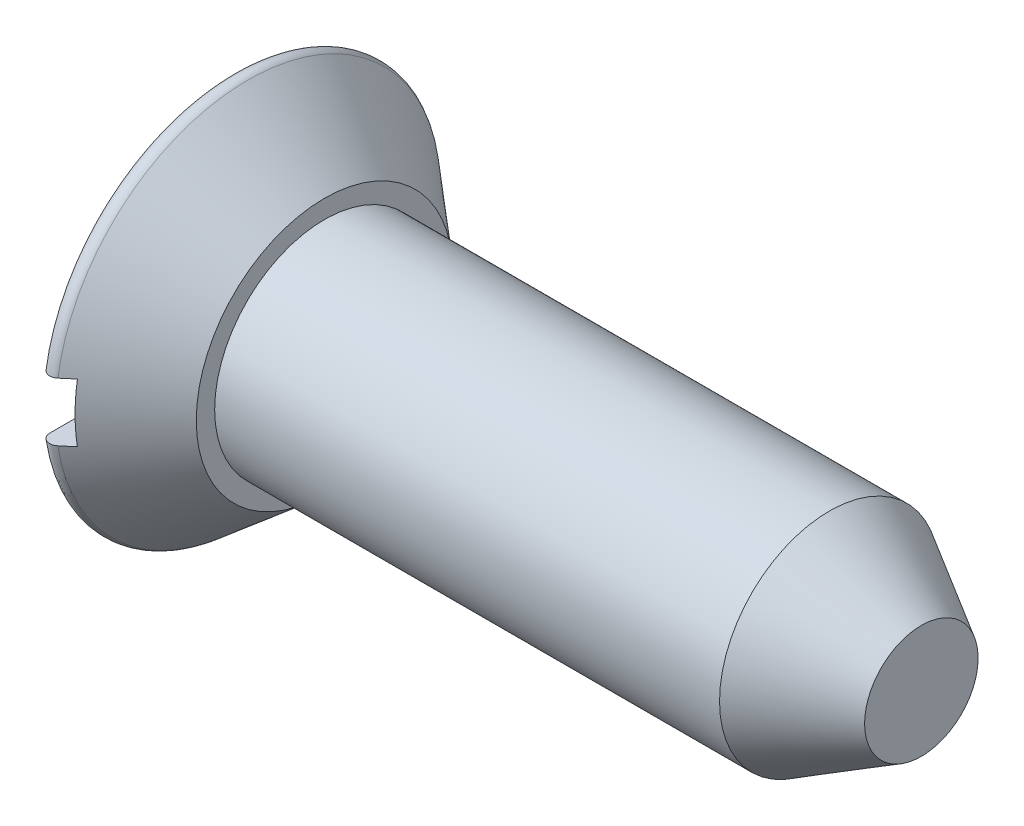
ISO-10303-21;
HEADER;
FILE_DESCRIPTION(('STEP AP214'),'2;1');
FILE_NAME('part.step','',(''),(''),'','','');
FILE_SCHEMA(('AUTOMOTIVE_DESIGN { 1 0 10303 214 1 1 1 1 }'));
ENDSEC;
DATA;
#1=APPLICATION_CONTEXT('core data for automotive mechanical design processes');
#2=APPLICATION_PROTOCOL_DEFINITION('international standard','automotive_design',2000,#1);
#3=PRODUCT_CONTEXT('',#1,'mechanical');
#4=PRODUCT('Part','Part','',(#3));
#5=PRODUCT_RELATED_PRODUCT_CATEGORY('part','',(#4));
#6=PRODUCT_DEFINITION_FORMATION('','',#4);
#7=PRODUCT_DEFINITION_CONTEXT('part definition',#1,'design');
#8=PRODUCT_DEFINITION('design','',#6,#7);
#9=PRODUCT_DEFINITION_SHAPE('','',#8);
#10=(LENGTH_UNIT() NAMED_UNIT(*) SI_UNIT(.MILLI.,.METRE.));
#11=(NAMED_UNIT(*) PLANE_ANGLE_UNIT() SI_UNIT($,.RADIAN.));
#12=(NAMED_UNIT(*) SI_UNIT($,.STERADIAN.) SOLID_ANGLE_UNIT());
#13=UNCERTAINTY_MEASURE_WITH_UNIT(LENGTH_MEASURE(1.E-05),#10,'distance_accuracy_value','');
#14=(GEOMETRIC_REPRESENTATION_CONTEXT(3) GLOBAL_UNCERTAINTY_ASSIGNED_CONTEXT((#13)) GLOBAL_UNIT_ASSIGNED_CONTEXT((#10,
#11,#12)) REPRESENTATION_CONTEXT('',''));
#15=CARTESIAN_POINT('',(0.,0.,0.));
#16=DIRECTION('',(0.,0.,1.));
#17=DIRECTION('',(1.,0.,0.));
#18=AXIS2_PLACEMENT_3D('',#15,#16,#17);
#19=CARTESIAN_POINT('',(0.,0.,0.));
#20=DIRECTION('',(-1.,0.,0.));
#21=DIRECTION('',(0.,0.,1.));
#22=AXIS2_PLACEMENT_3D('',#19,#20,#21);
#23=CYLINDRICAL_SURFACE('',#22,0.762);
#24=CARTESIAN_POINT('',(0.635,0.,0.));
#25=DIRECTION('',(-1.,0.,0.));
#26=DIRECTION('',(0.,0.,1.));
#27=AXIS2_PLACEMENT_3D('',#24,#25,#26);
#28=CIRCLE('',#27,0.762);
#29=CARTESIAN_POINT('',(0.635,0.,0.762));
#30=VERTEX_POINT('',#29);
#31=EDGE_CURVE('E167',#30,#30,#28,.T.);
#32=ORIENTED_EDGE('',*,*,#31,.F.);
#33=EDGE_LOOP('',(#32));
#34=FACE_BOUND('',#33,.T.);
#35=CARTESIAN_POINT('',(4.13728568757237,0.,0.));
#36=DIRECTION('',(-1.,0.,0.));
#37=DIRECTION('',(0.,0.,1.));
#38=AXIS2_PLACEMENT_3D('',#35,#36,#37);
#39=CIRCLE('',#38,0.762);
#40=CARTESIAN_POINT('',(4.13728568757237,0.,0.762));
#41=VERTEX_POINT('',#40);
#42=EDGE_CURVE('E217',#41,#41,#39,.T.);
#43=ORIENTED_EDGE('',*,*,#42,.T.);
#44=EDGE_LOOP('',(#43));
#45=FACE_BOUND('',#44,.T.);
#46=ADVANCED_FACE('F68',(#34,#45),#23,.T.);
#47=CARTESIAN_POINT('',(0.,0.,0.));
#48=DIRECTION('',(1.,0.,0.));
#49=DIRECTION('',(0.,0.,-1.));
#50=AXIS2_PLACEMENT_3D('',#47,#48,#49);
#51=PLANE('',#50);
#52=CARTESIAN_POINT('',(0.,0.,0.));
#53=DIRECTION('',(-1.,0.,0.));
#54=DIRECTION('',(0.,0.,1.));
#55=AXIS2_PLACEMENT_3D('',#52,#53,#54);
#56=CIRCLE('',#55,1.28622381054764);
#57=CARTESIAN_POINT('',(0.,0.2032,1.27007143532153));
#58=VERTEX_POINT('',#57);
#59=CARTESIAN_POINT('',(0.,0.2032,-1.27007143532153));
#60=VERTEX_POINT('',#59);
#61=EDGE_CURVE('E153',#58,#60,#56,.T.);
#62=ORIENTED_EDGE('',*,*,#61,.T.);
#63=DIRECTION('',(0.,0.,1.));
#64=VECTOR('',#63,1.);
#65=CARTESIAN_POINT('',(0.,0.2032,-1.34972381054764));
#66=LINE('',#65,#64);
#67=EDGE_CURVE('E202',#60,#58,#66,.T.);
#68=ORIENTED_EDGE('',*,*,#67,.T.);
#69=EDGE_LOOP('',(#62,#68));
#70=FACE_BOUND('',#69,.T.);
#71=ADVANCED_FACE('F229',(#70),#51,.F.);
#72=CARTESIAN_POINT('',(0.0635,0.,0.));
#73=DIRECTION('',(-1.,0.,0.));
#74=DIRECTION('',(0.,0.,1.));
#75=AXIS2_PLACEMENT_3D('',#72,#73,#74);
#76=TOROIDAL_SURFACE('',#75,1.28622381054764,0.0634999999999999);
#77=CARTESIAN_POINT('',(0.104317013215095,0.,0.));
#78=DIRECTION('',(-1.,0.,0.));
#79=DIRECTION('',(0.,0.,1.));
#80=AXIS2_PLACEMENT_3D('',#77,#78,#79);
#81=CIRCLE('',#80,1.3348676326857);
#82=CARTESIAN_POINT('',(0.104317013215079,0.2032,1.31931094014715));
#83=VERTEX_POINT('',#82);
#84=CARTESIAN_POINT('',(0.104317013215095,0.2032,-1.31931094014714));
#85=VERTEX_POINT('',#84);
#86=EDGE_CURVE('E160',#83,#85,#81,.T.);
#87=ORIENTED_EDGE('',*,*,#86,.T.);
#88=CARTESIAN_POINT('',(0.0245970607754166,0.2032,-1.32087306265502));
#89=CARTESIAN_POINT('',(0.0217621434632,0.2032,-1.3186495160942));
#90=CARTESIAN_POINT('',(0.0191144712149121,0.2032,-1.31618267251871));
#91=CARTESIAN_POINT('',(0.0142700673508127,0.2032,-1.31083617933155));
#92=CARTESIAN_POINT('',(0.0120739458474321,0.2032,-1.30795598001571));
#93=CARTESIAN_POINT('',(0.00819684086409784,0.2032,-1.30187126711281));
#94=CARTESIAN_POINT('',(0.00651536116637185,0.2032,-1.29866706991667));
#95=CARTESIAN_POINT('',(0.00370972245081382,0.2032,-1.29202456628145));
#96=CARTESIAN_POINT('',(0.00258542464236729,0.2032,-1.28858631838591));
#97=CARTESIAN_POINT('',(0.000915373007584935,0.2032,-1.28154210359229));
#98=CARTESIAN_POINT('',(0.000374461878236928,0.2032,-1.27793498829513));
#99=CARTESIAN_POINT('',(-9.85513835356554E-05,0.2032,-1.27068084593136));
#100=CARTESIAN_POINT('',(-3.05991733546914E-05,0.2032,-1.26703381533122));
#101=CARTESIAN_POINT('',(0.000714568749422348,0.2032,-1.25977791148795));
#102=CARTESIAN_POINT('',(0.00139583035496446,0.2032,-1.25616945288688));
#103=CARTESIAN_POINT('',(0.00335504806334988,0.2032,-1.24911821974382));
#104=CARTESIAN_POINT('',(0.0046330083895952,0.2032,-1.24567544637472));
#105=CARTESIAN_POINT('',(0.00774975336804779,0.2032,-1.23905821914333));
#106=CARTESIAN_POINT('',(0.00958793521830538,0.2032,-1.23588348153888));
#107=CARTESIAN_POINT('',(0.0137757701273944,0.2032,-1.2298913302276));
#108=CARTESIAN_POINT('',(0.0161254014641144,0.2032,-1.22707390135332));
#109=CARTESIAN_POINT('',(0.021247693615981,0.2032,-1.22190446788357));
#110=CARTESIAN_POINT('',(0.0240163497140171,0.2032,-1.21954849632651));
#111=CARTESIAN_POINT('',(0.0299143907499938,0.2032,-1.21534225482563));
#112=CARTESIAN_POINT('',(0.0330437491165888,0.2032,-1.21349194766555));
#113=CARTESIAN_POINT('',(0.0395299979518517,0.2032,-1.21037547531237));
#114=CARTESIAN_POINT('',(0.0428833342908178,0.2032,-1.20910191244466));
#115=CARTESIAN_POINT('',(0.0497576011723741,0.2032,-1.20714299206282));
#116=CARTESIAN_POINT('',(0.053278519691987,0.2032,-1.20645759241859));
#117=CARTESIAN_POINT('',(0.0603461645269453,0.2032,-1.20570077137093));
#118=CARTESIAN_POINT('',(0.0638921730510086,0.2032,-1.20562263359503));
#119=CARTESIAN_POINT('',(0.0709465573425047,0.2032,-1.20606504566706));
#120=CARTESIAN_POINT('',(0.0744549342785635,0.2032,-1.20658557686903));
#121=CARTESIAN_POINT('',(0.081322462706585,0.2032,-1.20820641247036));
#122=CARTESIAN_POINT('',(0.0846820766472199,0.2032,-1.20930475989397));
#123=CARTESIAN_POINT('',(0.0911708110951108,0.2032,-1.21204664137925));
#124=CARTESIAN_POINT('',(0.0942999268559857,0.2032,-1.21369018666371));
#125=CARTESIAN_POINT('',(0.100259710328198,0.2032,-1.21748487700427));
#126=CARTESIAN_POINT('',(0.103088487610082,0.2032,-1.21963898974091));
#127=CARTESIAN_POINT('',(0.108349755692583,0.2032,-1.2243862801993));
#128=CARTESIAN_POINT('',(0.110782223005227,0.2032,-1.22697948392596));
#129=CARTESIAN_POINT('',(0.115213752064233,0.2032,-1.23256496677377));
#130=CARTESIAN_POINT('',(0.117207157589049,0.2032,-1.23556173315642));
#131=CARTESIAN_POINT('',(0.120669898581364,0.2032,-1.24184409759308));
#132=CARTESIAN_POINT('',(0.12213919760346,0.2032,-1.24512971571351));
#133=CARTESIAN_POINT('',(0.124530644145325,0.2032,-1.2519409814131));
#134=CARTESIAN_POINT('',(0.125445672975907,0.2032,-1.25546912940014));
#135=CARTESIAN_POINT('',(0.126675247854449,0.2032,-1.26262860348094));
#136=CARTESIAN_POINT('',(0.126989763910751,0.2032,-1.26625993471882));
#137=CARTESIAN_POINT('',(0.127009815679493,0.2032,-1.27355096271475));
#138=CARTESIAN_POINT('',(0.126710883220832,0.2032,-1.27721067279191));
#139=CARTESIAN_POINT('',(0.125502417590266,0.2032,-1.28442794892154));
#140=CARTESIAN_POINT('',(0.124592880152638,0.2032,-1.28798551426023));
#141=CARTESIAN_POINT('',(0.122188004432332,0.2032,-1.29489360999882));
#142=CARTESIAN_POINT('',(0.120693158608986,0.2032,-1.29824431171052));
#143=CARTESIAN_POINT('',(0.117157709004731,0.2032,-1.30464435862818));
#144=CARTESIAN_POINT('',(0.115117123794174,0.2032,-1.30769371408347));
#145=CARTESIAN_POINT('',(0.110565002974888,0.2032,-1.31337735884522));
#146=CARTESIAN_POINT('',(0.108057420112546,0.2032,-1.31601481314099));
#147=CARTESIAN_POINT('',(0.102630470638232,0.2032,-1.3208252733628));
#148=CARTESIAN_POINT('',(0.0997111290132049,0.2032,-1.32299830745134));
#149=CARTESIAN_POINT('',(0.0935795988403746,0.2032,-1.32679163018768));
#150=CARTESIAN_POINT('',(0.0903711699026356,0.2032,-1.32841799610554));
#151=CARTESIAN_POINT('',(0.0837249789300342,0.2032,-1.33110261727334));
#152=CARTESIAN_POINT('',(0.0802872402268728,0.2032,-1.33216093022243));
#153=CARTESIAN_POINT('',(0.0733175863885446,0.2032,-1.3336692757594));
#154=CARTESIAN_POINT('',(0.0697869873794818,0.2032,-1.33412539507137));
#155=CARTESIAN_POINT('',(0.0626985134081476,0.2032,-1.33443538209166));
#156=CARTESIAN_POINT('',(0.0591406326533221,0.2032,-1.33428911815539));
#157=CARTESIAN_POINT('',(0.0521157701677095,0.2032,-1.33340064269641));
#158=CARTESIAN_POINT('',(0.0486484688570625,0.2032,-1.33266094226648));
#159=CARTESIAN_POINT('',(0.04188995840097,0.2032,-1.33061137599089));
#160=CARTESIAN_POINT('',(0.0385985387678076,0.2032,-1.32930220963258));
#161=CARTESIAN_POINT('',(0.0335237405095485,0.2032,-1.32677376029801));
#162=CARTESIAN_POINT('',(0.0316555341489443,0.2032,-1.32572089607706));
#163=CARTESIAN_POINT('',(0.0280351646014662,0.2032,-1.32343172411436));
#164=CARTESIAN_POINT('',(0.0262830008086654,0.2032,-1.32219541733059));
#165=CARTESIAN_POINT('',(0.0245970607754166,0.2032,-1.32087306265502));
#166=B_SPLINE_CURVE_WITH_KNOTS('',3,(#88,#89,#90,#91,#92,#93,#94,#95,#96,#97,#98,#99,#100,#101,
#102,#103,#104,#105,#106,#107,#108,#109,#110,#111,#112,#113,#114,#115,#116,#117,#118,#119,#120,
#121,#122,#123,#124,#125,#126,#127,#128,#129,#130,#131,#132,#133,#134,#135,#136,#137,#138,#139,
#140,#141,#142,#143,#144,#145,#146,#147,#148,#149,#150,#151,#152,#153,#154,#155,#156,#157,#158,
#159,#160,#161,#162,#163,#164,#165),.UNSPECIFIED.,.T.,.F.,(4,2,2,2,2,2,2,2,2,2,2,2,2,2,2,2,2,2,
2,2,2,2,2,2,2,2,2,2,2,2,2,2,2,2,2,2,2,2,4),(0.,0.0108007771730887,0.0216160532745681,
0.0324208681912106,0.0432229903397941,0.054114106731627,0.0650061951930503,0.0759706676244004,
0.0869352176628836,0.0978880111810849,0.108840339606637,0.11969392923094,0.130546719829528,
0.141256063038079,0.151964639072729,0.162554606332944,0.173144243770451,0.183698244448189,
0.194252462391481,0.204869600067415,0.215487366757077,0.226234812948364,0.236983006351655,
0.247866467179885,0.258750471551118,0.269714032996966,0.28067767103572,0.291632104381335,
0.302586165018244,0.313451407237345,0.324315990399473,0.335055456210079,0.345793830968517,
0.356422813931813,0.367054119871915,0.377640675828526,0.388214264647942,0.39463757641023,
0.401060854629965),.UNSPECIFIED.);
#167=EDGE_CURVE('E174',#85,#60,#166,.T.);
#168=ORIENTED_EDGE('',*,*,#167,.T.);
#169=ORIENTED_EDGE('',*,*,#61,.F.);
#170=CARTESIAN_POINT('',(0.0369446836404255,0.2032,1.2116220084821));
#171=CARTESIAN_POINT('',(0.033701320883598,0.2032,1.21313624462319));
#172=CARTESIAN_POINT('',(0.030584580723122,0.2032,1.21492831215649));
#173=CARTESIAN_POINT('',(0.0246950035465472,0.2032,1.21901363201327));
#174=CARTESIAN_POINT('',(0.0219226334405282,0.2032,1.22130755338777));
#175=CARTESIAN_POINT('',(0.0168036839226446,0.2032,1.22632468259948));
#176=CARTESIAN_POINT('',(0.0144566633554845,0.2032,1.22904744012156));
#177=CARTESIAN_POINT('',(0.0102484918030079,0.2032,1.23484418183559));
#178=CARTESIAN_POINT('',(0.00838722352563452,0.2032,1.23791808098101));
#179=CARTESIAN_POINT('',(0.00518252074556039,0.2032,1.24436256304005));
#180=CARTESIAN_POINT('',(0.00384433646075641,0.2032,1.24773575682565));
#181=CARTESIAN_POINT('',(0.00174695147259897,0.2032,1.25465776449687));
#182=CARTESIAN_POINT('',(0.000987808940133601,0.2032,1.25820659598903));
#183=CARTESIAN_POINT('',(6.40048051441572E-05,0.2032,1.26541627417997));
#184=CARTESIAN_POINT('',(-9.47599389145093E-05,0.2032,1.26907787766121));
#185=CARTESIAN_POINT('',(0.000203092567931826,0.2032,1.27637604987189));
#186=CARTESIAN_POINT('',(0.000659724358023874,0.2032,1.28001261800782));
#187=CARTESIAN_POINT('',(0.00217856173992666,0.2032,1.28716586018161));
#188=CARTESIAN_POINT('',(0.003242149205794,0.2032,1.29068224115601));
#189=CARTESIAN_POINT('',(0.00594791053381619,0.2032,1.2974849788774));
#190=CARTESIAN_POINT('',(0.00759007114845006,0.2032,1.30077134088904));
#191=CARTESIAN_POINT('',(0.0113975358046633,0.2032,1.3069998031659));
#192=CARTESIAN_POINT('',(0.013559787393101,0.2032,1.30994376867309));
#193=CARTESIAN_POINT('',(0.0183528399579222,0.2032,1.31542185831302));
#194=CARTESIAN_POINT('',(0.0209836154032759,0.2032,1.31795600476347));
#195=CARTESIAN_POINT('',(0.0266087466573123,0.2032,1.32251295331167));
#196=CARTESIAN_POINT('',(0.0295988591420612,0.2032,1.3245409929891));
#197=CARTESIAN_POINT('',(0.0358801743488216,0.2032,1.32805963259538));
#198=CARTESIAN_POINT('',(0.0391713573060198,0.2032,1.3295502677723));
#199=CARTESIAN_POINT('',(0.0459217971437333,0.2032,1.33193485715133));
#200=CARTESIAN_POINT('',(0.0493787664235269,0.2032,1.33283528931029));
#201=CARTESIAN_POINT('',(0.0563951690070397,0.2032,1.33403840252087));
#202=CARTESIAN_POINT('',(0.0599545974558271,0.2032,1.33434111184788));
#203=CARTESIAN_POINT('',(0.0670481882225755,0.2032,1.33433955692377));
#204=CARTESIAN_POINT('',(0.0705823522832745,0.2032,1.33403954395836));
#205=CARTESIAN_POINT('',(0.0775500017745522,0.2032,1.33285018046948));
#206=CARTESIAN_POINT('',(0.0809834884881857,0.2032,1.33196083745998));
#207=CARTESIAN_POINT('',(0.0876519302029243,0.2032,1.32961991023491));
#208=CARTESIAN_POINT('',(0.0908869395221327,0.2032,1.32816848065009));
#209=CARTESIAN_POINT('',(0.0970695128109183,0.2032,1.32474648563549));
#210=CARTESIAN_POINT('',(0.100017069608449,0.2032,1.32277590725729));
#211=CARTESIAN_POINT('',(0.105562292561205,0.2032,1.31835874548031));
#212=CARTESIAN_POINT('',(0.108157557406764,0.2032,1.31590914842163));
#213=CARTESIAN_POINT('',(0.112905381770476,0.2032,1.31061317364094));
#214=CARTESIAN_POINT('',(0.115057917982579,0.2032,1.30776677504379));
#215=CARTESIAN_POINT('',(0.1188842659262,0.2032,1.30172513578665));
#216=CARTESIAN_POINT('',(0.120552630250853,0.2032,1.2985264453605));
#217=CARTESIAN_POINT('',(0.123335388897912,0.2032,1.29189656965408));
#218=CARTESIAN_POINT('',(0.124449748729637,0.2032,1.28846536991358));
#219=CARTESIAN_POINT('',(0.126105064336233,0.2032,1.28142728329144));
#220=CARTESIAN_POINT('',(0.126639555992883,0.2032,1.27781887537192));
#221=CARTESIAN_POINT('',(0.127099550796507,0.2032,1.27056340244197));
#222=CARTESIAN_POINT('',(0.127025026088524,0.2032,1.266916335671));
#223=CARTESIAN_POINT('',(0.126266734911492,0.2032,1.25966157209597));
#224=CARTESIAN_POINT('',(0.125578941505872,0.2032,1.25605429532253));
#225=CARTESIAN_POINT('',(0.123606920757542,0.2032,1.24900650372851));
#226=CARTESIAN_POINT('',(0.122322687078774,0.2032,1.2455659906799));
#227=CARTESIAN_POINT('',(0.119193912078109,0.2032,1.23895449213746));
#228=CARTESIAN_POINT('',(0.117350000769133,0.2032,1.23578320868995));
#229=CARTESIAN_POINT('',(0.113151348742061,0.2032,1.22979889055926));
#230=CARTESIAN_POINT('',(0.110796627889372,0.2032,1.22698584195106));
#231=CARTESIAN_POINT('',(0.105665048072462,0.2032,1.22182599767495));
#232=CARTESIAN_POINT('',(0.10289219431726,0.2032,1.21947521996297));
#233=CARTESIAN_POINT('',(0.0969868090551037,0.2032,1.21528010987451));
#234=CARTESIAN_POINT('',(0.0938543188842302,0.2032,1.21343571937711));
#235=CARTESIAN_POINT('',(0.087363302695827,0.2032,1.21033160017445));
#236=CARTESIAN_POINT('',(0.084008346389005,0.2032,1.20906440557885));
#237=CARTESIAN_POINT('',(0.0771309841896904,0.2032,1.20711809700652));
#238=CARTESIAN_POINT('',(0.0736085474854588,0.2032,1.20643909168533));
#239=CARTESIAN_POINT('',(0.0665375124747421,0.2032,1.20569486466488));
#240=CARTESIAN_POINT('',(0.0629895834143568,0.2032,1.20562323605605));
#241=CARTESIAN_POINT('',(0.0559355763288465,0.2032,1.20607947379276));
#242=CARTESIAN_POINT('',(0.0524294509440982,0.2032,1.20660658014939));
#243=CARTESIAN_POINT('',(0.0469218214293696,0.2032,1.20791670616771));
#244=CARTESIAN_POINT('',(0.0448746887136739,0.2032,1.20851552186135));
#245=CARTESIAN_POINT('',(0.0408516373248149,0.2032,1.20991740069212));
#246=CARTESIAN_POINT('',(0.0388757180367124,0.2032,1.21072046206507));
#247=CARTESIAN_POINT('',(0.0369446836404255,0.2032,1.2116220084821));
#248=B_SPLINE_CURVE_WITH_KNOTS('',3,(#170,#171,#172,#173,#174,#175,#176,#177,#178,#179,#180,
#181,#182,#183,#184,#185,#186,#187,#188,#189,#190,#191,#192,#193,#194,#195,#196,#197,#198,#199,
#200,#201,#202,#203,#204,#205,#206,#207,#208,#209,#210,#211,#212,#213,#214,#215,#216,#217,#218,
#219,#220,#221,#222,#223,#224,#225,#226,#227,#228,#229,#230,#231,#232,#233,#234,#235,#236,#237,
#238,#239,#240,#241,#242,#243,#244,#245,#246,#247),.UNSPECIFIED.,.T.,.F.,(4,2,2,2,2,2,2,2,2,2,2,
2,2,2,2,2,2,2,2,2,2,2,2,2,2,2,2,2,2,2,2,2,2,2,2,2,2,2,4),(0.,0.0107303796266365,
0.0214751526885142,0.0322087171223949,0.0429396873757788,0.0537757570716559,0.0646129152223888,
0.0755562426172996,0.0864998285607467,0.0974684300657468,0.108436780440295,0.119342263458892,
0.130247152392334,0.141034014298901,0.151820168572078,0.162485860355065,0.173151047583483,
0.183741272319389,0.194331362032368,0.204918540464835,0.215505982983776,0.226162311681236,
0.236819201203987,0.247591714820303,0.258364899017476,0.269256981651061,0.280149562465329,
0.291114198836878,0.302078951689769,0.313031407326263,0.323983437097563,0.334836539498424,
0.345688395706181,0.356395595123303,0.36710477204755,0.377700840896545,0.388283474911949,
0.394672187081704,0.401060844070699),.UNSPECIFIED.);
#249=EDGE_CURVE('E170',#58,#83,#248,.T.);
#250=ORIENTED_EDGE('',*,*,#249,.T.);
#251=EDGE_LOOP('',(#87,#168,#169,#250));
#252=FACE_BOUND('',#251,.T.);
#253=ADVANCED_FACE('F209',(#252),#76,.T.);
#254=CARTESIAN_POINT('',(0.,-0.2032,-1.27007143532169));
#255=VERTEX_POINT('',#254);
#256=CARTESIAN_POINT('',(0.,-0.2032,1.27007143532153));
#257=VERTEX_POINT('',#256);
#258=EDGE_CURVE('E155',#255,#257,#56,.T.);
#259=ORIENTED_EDGE('',*,*,#258,.T.);
#260=DIRECTION('',(0.,0.,1.));
#261=VECTOR('',#260,1.);
#262=CARTESIAN_POINT('',(0.,-0.2032,-1.34972381054764));
#263=LINE('',#262,#261);
#264=EDGE_CURVE('E140',#255,#257,#263,.T.);
#265=ORIENTED_EDGE('',*,*,#264,.F.);
#266=EDGE_LOOP('',(#259,#265));
#267=FACE_BOUND('',#266,.T.);
#268=ADVANCED_FACE('F70',(#267),#51,.F.);
#269=ORIENTED_EDGE('',*,*,#258,.F.);
#270=CARTESIAN_POINT('',(0.0245970607754166,-0.2032,-1.32087306265502));
#271=CARTESIAN_POINT('',(0.0273876038156021,-0.2032,-1.32306140087063));
#272=CARTESIAN_POINT('',(0.0303635524948952,-0.2032,-1.32501721586372));
#273=CARTESIAN_POINT('',(0.0366035151487539,-0.2032,-1.32840390350738));
#274=CARTESIAN_POINT('',(0.0398678348297315,-0.2032,-1.32983421057043));
#275=CARTESIAN_POINT('',(0.0465905773961135,-0.2032,-1.33212487932082));
#276=CARTESIAN_POINT('',(0.0500489725030674,-0.2032,-1.33298532234952));
#277=CARTESIAN_POINT('',(0.057060546086962,-0.2032,-1.33410999038113));
#278=CARTESIAN_POINT('',(0.0606137019482097,-0.2032,-1.33437435637849));
#279=CARTESIAN_POINT('',(0.0676972171472991,-0.2032,-1.3342994670904));
#280=CARTESIAN_POINT('',(0.0712276060815723,-0.2032,-1.33396298788562));
#281=CARTESIAN_POINT('',(0.0781817776609909,-0.2032,-1.33270196518756));
#282=CARTESIAN_POINT('',(0.0816055578202627,-0.2032,-1.33177740799239));
#283=CARTESIAN_POINT('',(0.088249608162948,-0.2032,-1.32936810882525));
#284=CARTESIAN_POINT('',(0.0914698916923131,-0.2032,-1.32788340363417));
#285=CARTESIAN_POINT('',(0.0976177277547575,-0.2032,-1.32439787634022));
#286=CARTESIAN_POINT('',(0.100545273213142,-0.2032,-1.32239704176809));
#287=CARTESIAN_POINT('',(0.106046184755834,-0.2032,-1.31792262035239));
#288=CARTESIAN_POINT('',(0.108617051114172,-0.2032,-1.3154459612069));
#289=CARTESIAN_POINT('',(0.113311960528763,-0.2032,-1.3101003197349));
#290=CARTESIAN_POINT('',(0.115435980446915,-0.2032,-1.30723131710518));
#291=CARTESIAN_POINT('',(0.119201800553091,-0.2032,-1.3011490604265));
#292=CARTESIAN_POINT('',(0.120838079796221,-0.2032,-1.29793238829883));
#293=CARTESIAN_POINT('',(0.123554091888886,-0.2032,-1.29127210734495));
#294=CARTESIAN_POINT('',(0.124633789849683,-0.2032,-1.28782848430781));
#295=CARTESIAN_POINT('',(0.126217665568731,-0.2032,-1.28077157469987));
#296=CARTESIAN_POINT('',(0.126715401605214,-0.2032,-1.27715684159058));
#297=CARTESIAN_POINT('',(0.127101218881359,-0.2032,-1.26989493263869));
#298=CARTESIAN_POINT('',(0.126989272289567,-0.2032,-1.26624775532263));
#299=CARTESIAN_POINT('',(0.126156274519914,-0.2032,-1.25899978406096));
#300=CARTESIAN_POINT('',(0.125431319465673,-0.2032,-1.25539943791935));
#301=CARTESIAN_POINT('',(0.123386509160119,-0.2032,-1.24837172120714));
#302=CARTESIAN_POINT('',(0.12206664956723,-0.2032,-1.24494435189913));
#303=CARTESIAN_POINT('',(0.118869590636286,-0.2032,-1.23836591743836));
#304=CARTESIAN_POINT('',(0.116993162370014,-0.2032,-1.23521447778437));
#305=CARTESIAN_POINT('',(0.11273320826328,-0.2032,-1.2292751669265));
#306=CARTESIAN_POINT('',(0.110349703748251,-0.2032,-1.22648728044109));
#307=CARTESIAN_POINT('',(0.105165982397372,-0.2032,-1.22138274973065));
#308=CARTESIAN_POINT('',(0.102369826008104,-0.2032,-1.21906198330566));
#309=CARTESIAN_POINT('',(0.0964231692130693,-0.2032,-1.21493035146235));
#310=CARTESIAN_POINT('',(0.0932726955366446,-0.2032,-1.21311944761657));
#311=CARTESIAN_POINT('',(0.0867516500563605,-0.2032,-1.21008431898589));
#312=CARTESIAN_POINT('',(0.0833845497313424,-0.2032,-1.20885263495111));
#313=CARTESIAN_POINT('',(0.0764900939437293,-0.2032,-1.20697907783407));
#314=CARTESIAN_POINT('',(0.0729627497803374,-0.2032,-1.20633716323318));
#315=CARTESIAN_POINT('',(0.0658890901600787,-0.2032,-1.20566699200438));
#316=CARTESIAN_POINT('',(0.0623433986080398,-0.2032,-1.2056321350778));
#317=CARTESIAN_POINT('',(0.0552969040334316,-0.2032,-1.20616022342229));
#318=CARTESIAN_POINT('',(0.0517960997093059,-0.2032,-1.20672315132007));
#319=CARTESIAN_POINT('',(0.0449494436718151,-0.2032,-1.20842675367439));
#320=CARTESIAN_POINT('',(0.0416031548304002,-0.2032,-1.20956567342411));
#321=CARTESIAN_POINT('',(0.0351475660337754,-0.2032,-1.21238573667727));
#322=CARTESIAN_POINT('',(0.032038271137995,-0.2032,-1.21406689175253));
#323=CARTESIAN_POINT('',(0.0261231889055708,-0.2032,-1.21793359852865));
#324=CARTESIAN_POINT('',(0.0233194246844412,-0.2032,-1.22012224372429));
#325=CARTESIAN_POINT('',(0.0181134956131794,-0.2032,-1.2249339254697));
#326=CARTESIAN_POINT('',(0.0157113556299766,-0.2032,-1.22755698889688));
#327=CARTESIAN_POINT('',(0.0113450663648327,-0.2032,-1.23319742985056));
#328=CARTESIAN_POINT('',(0.00938668497802724,-0.2032,-1.23621927199663));
#329=CARTESIAN_POINT('',(0.00599771413347363,-0.2032,-1.24254567140707));
#330=CARTESIAN_POINT('',(0.00456716230999491,-0.2032,-1.2458502488098));
#331=CARTESIAN_POINT('',(0.00225653730820072,-0.2032,-1.25269272856099));
#332=CARTESIAN_POINT('',(0.0013835694544937,-0.2032,-1.25623303134129));
#333=CARTESIAN_POINT('',(0.000239761429158741,-0.2032,-1.26340952061442));
#334=CARTESIAN_POINT('',(-3.10726790529825E-05,-0.2032,-1.26704570807243));
#335=CARTESIAN_POINT('',(3.6978338876149E-05,-0.2032,-1.27433773112099));
#336=CARTESIAN_POINT('',(0.000380107957130264,-0.2032,-1.27799352793789));
#337=CARTESIAN_POINT('',(0.00167603339728356,-0.2032,-1.28519653520646));
#338=CARTESIAN_POINT('',(0.00262898280785792,-0.2032,-1.28874371806681));
#339=CARTESIAN_POINT('',(0.00511854177196273,-0.2032,-1.2956241083582));
#340=CARTESIAN_POINT('',(0.00665476449615281,-0.2032,-1.29895745589671));
#341=CARTESIAN_POINT('',(0.0102687161631535,-0.2032,-1.30531286935644));
#342=CARTESIAN_POINT('',(0.0123457745156059,-0.2032,-1.3083353143413));
#343=CARTESIAN_POINT('',(0.0161360746682049,-0.2032,-1.31295107869341));
#344=CARTESIAN_POINT('',(0.0177062043044052,-0.2032,-1.31466390977929));
#345=CARTESIAN_POINT('',(0.0210234325828259,-0.2032,-1.31790872055943));
#346=CARTESIAN_POINT('',(0.0227705303295768,-0.2032,-1.31944070116872));
#347=CARTESIAN_POINT('',(0.0245970607754166,-0.2032,-1.32087306265502));
#348=B_SPLINE_CURVE_WITH_KNOTS('',3,(#270,#271,#272,#273,#274,#275,#276,#277,#278,#279,#280,
#281,#282,#283,#284,#285,#286,#287,#288,#289,#290,#291,#292,#293,#294,#295,#296,#297,#298,#299,
#300,#301,#302,#303,#304,#305,#306,#307,#308,#309,#310,#311,#312,#313,#314,#315,#316,#317,#318,
#319,#320,#321,#322,#323,#324,#325,#326,#327,#328,#329,#330,#331,#332,#333,#334,#335,#336,#337,
#338,#339,#340,#341,#342,#343,#344,#345,#346,#347),.UNSPECIFIED.,.T.,.F.,(4,2,2,2,2,2,2,2,2,2,2,
2,2,2,2,2,2,2,2,2,2,2,2,2,2,2,2,2,2,2,2,2,2,2,2,2,2,2,4),(0.,0.0106304016296518,
0.0212722111387311,0.0319125013276631,0.042550274426931,0.0531390250000981,0.0637280222941653,
0.0743163244060635,0.0849048823470337,0.0955642572937833,0.106224184056552,0.117000553996115,
0.127777599359505,0.13867283893441,0.149568575871174,0.160534228277027,0.171499960710849,
0.182450571587803,0.193400722020447,0.204249537961235,0.215097536026502,0.225801724026264,
0.236505158414326,0.247092145037518,0.257678823981581,0.268233444113908,0.27878828950688,
0.289409248682163,0.300030865220449,0.310783494889326,0.321536891073055,0.332424719710261,
0.343312657986128,0.354276158487628,0.365242421334038,0.376201423976344,0.387146902558398,
0.394104992863408,0.401063047961806),.UNSPECIFIED.);
#349=CARTESIAN_POINT('',(0.104317013215079,-0.2032,-1.31931094014715));
#350=VERTEX_POINT('',#349);
#351=EDGE_CURVE('E201',#255,#350,#348,.T.);
#352=ORIENTED_EDGE('',*,*,#351,.T.);
#353=CARTESIAN_POINT('',(0.104317013215095,-0.2032,1.31931094014714));
#354=VERTEX_POINT('',#353);
#355=EDGE_CURVE('E146',#350,#354,#81,.T.);
#356=ORIENTED_EDGE('',*,*,#355,.T.);
#357=CARTESIAN_POINT('',(0.0369446836404255,-0.2032,1.2116220084821));
#358=CARTESIAN_POINT('',(0.0401391756480239,-0.2032,1.21013094375844));
#359=CARTESIAN_POINT('',(0.0434610993539294,-0.2032,1.20890719037276));
#360=CARTESIAN_POINT('',(0.0502657791378776,-0.2032,1.20703351459986));
#361=CARTESIAN_POINT('',(0.053748704404118,-0.2032,1.20638421099138));
#362=CARTESIAN_POINT('',(0.0607735350372459,-0.2032,1.20568103057819));
#363=CARTESIAN_POINT('',(0.0643154239625996,-0.2032,1.20562699048469));
#364=CARTESIAN_POINT('',(0.0713568701458683,-0.2032,1.20611575447473));
#365=CARTESIAN_POINT('',(0.0748564367564567,-0.2032,1.20665842416328));
#366=CARTESIAN_POINT('',(0.0817083112763418,-0.2032,1.20832199710038));
#367=CARTESIAN_POINT('',(0.0850608807565319,-0.2032,1.20944182392177));
#368=CARTESIAN_POINT('',(0.0915321855091038,-0.2032,1.21222513720066));
#369=CARTESIAN_POINT('',(0.094650908067948,-0.2032,1.21388865319055));
#370=CARTESIAN_POINT('',(0.10058716971037,-0.2032,1.21772157965626));
#371=CARTESIAN_POINT('',(0.103402753379772,-0.2032,1.21989401726258));
#372=CARTESIAN_POINT('',(0.108634806465781,-0.2032,1.22467548507573));
#373=CARTESIAN_POINT('',(0.111051252597222,-0.2032,1.22728454073644));
#374=CARTESIAN_POINT('',(0.115448314674168,-0.2032,1.23289922035901));
#375=CARTESIAN_POINT('',(0.117423213695281,-0.2032,1.23590932109641));
#376=CARTESIAN_POINT('',(0.120846956639432,-0.2032,1.24221511306928));
#377=CARTESIAN_POINT('',(0.122295764845852,-0.2032,1.24551082367618));
#378=CARTESIAN_POINT('',(0.124644449367908,-0.2032,1.25233870092568));
#379=CARTESIAN_POINT('',(0.12553721869913,-0.2032,1.25587331330189));
#380=CARTESIAN_POINT('',(0.126721420318995,-0.2032,1.26304192824939));
#381=CARTESIAN_POINT('',(0.127012822636504,-0.2032,1.26667593576524));
#382=CARTESIAN_POINT('',(0.126986216449756,-0.2032,1.27396791385796));
#383=CARTESIAN_POINT('',(0.126663824036808,-0.2032,1.27762586945478));
#384=CARTESIAN_POINT('',(0.125408964856986,-0.2032,1.28483569697634));
#385=CARTESIAN_POINT('',(0.124476493911628,-0.2032,1.28838756817433));
#386=CARTESIAN_POINT('',(0.122027119696785,-0.2032,1.29527989330568));
#387=CARTESIAN_POINT('',(0.120510800133967,-0.2032,1.29862055452658));
#388=CARTESIAN_POINT('',(0.116934354935211,-0.2032,1.30499698210335));
#389=CARTESIAN_POINT('',(0.114874249180273,-0.2032,1.30803275960028));
#390=CARTESIAN_POINT('',(0.110286015842347,-0.2032,1.31368588507666));
#391=CARTESIAN_POINT('',(0.107761871656538,-0.2032,1.31630646526501));
#392=CARTESIAN_POINT('',(0.102304906048454,-0.2032,1.32108059172033));
#393=CARTESIAN_POINT('',(0.0993721103359604,-0.2032,1.32323416734653));
#394=CARTESIAN_POINT('',(0.0932174453354933,-0.2032,1.32698672971917));
#395=CARTESIAN_POINT('',(0.0899993070692916,-0.2032,1.32859183606087));
#396=CARTESIAN_POINT('',(0.083337336063007,-0.2032,1.33123271238926));
#397=CARTESIAN_POINT('',(0.0798935171136557,-0.2032,1.33226851712817));
#398=CARTESIAN_POINT('',(0.0729150272078139,-0.2032,1.3337315581664));
#399=CARTESIAN_POINT('',(0.0693816106726819,-0.2032,1.33416478216024));
#400=CARTESIAN_POINT('',(0.0622923934443559,-0.2032,1.33442885399155));
#401=CARTESIAN_POINT('',(0.0587365935450775,-0.2032,1.3342597230751));
#402=CARTESIAN_POINT('',(0.0517206101192938,-0.2032,1.33332643750259));
#403=CARTESIAN_POINT('',(0.0482600641172784,-0.2032,1.33256500347527));
#404=CARTESIAN_POINT('',(0.0415154498613549,-0.2032,1.33047336731771));
#405=CARTESIAN_POINT('',(0.0382313821031731,-0.2032,1.32914316358989));
#406=CARTESIAN_POINT('',(0.0319233752482242,-0.2032,1.32594953727513));
#407=CARTESIAN_POINT('',(0.0289001113864654,-0.2032,1.3240847816018));
#408=CARTESIAN_POINT('',(0.0232061106075238,-0.2032,1.31987824827088));
#409=CARTESIAN_POINT('',(0.0205353865450686,-0.2032,1.31753645322682));
#410=CARTESIAN_POINT('',(0.0155971271149419,-0.2032,1.31242134410947));
#411=CARTESIAN_POINT('',(0.0133332606861183,-0.2032,1.3096444886969));
#412=CARTESIAN_POINT('',(0.00929757416175254,-0.2032,1.30375374568963));
#413=CARTESIAN_POINT('',(0.00752578398784962,-0.2032,1.30063983761579));
#414=CARTESIAN_POINT('',(0.00450308955781212,-0.2032,1.29412516384009));
#415=CARTESIAN_POINT('',(0.00325839519330837,-0.2032,1.29072151669362));
#416=CARTESIAN_POINT('',(0.00135182586502732,-0.2032,1.28375471355721));
#417=CARTESIAN_POINT('',(0.000689986240224276,-0.2032,1.28019154790928));
#418=CARTESIAN_POINT('',(-3.76868073480464E-05,-0.2032,1.27296932495668));
#419=CARTESIAN_POINT('',(-9.75863666419817E-05,-0.2032,1.2693096688691));
#420=CARTESIAN_POINT('',(0.000395269840199111,-0.2032,1.26203190191732));
#421=CARTESIAN_POINT('',(0.00094802327615083,-0.2032,1.25841379089516));
#422=CARTESIAN_POINT('',(0.00265460143067955,-0.2032,1.25130772739452));
#423=CARTESIAN_POINT('',(0.00381067215408514,-0.2032,1.24782031382718));
#424=CARTESIAN_POINT('',(0.00669476454728699,-0.2032,1.24108934256729));
#425=CARTESIAN_POINT('',(0.00842292158178943,-0.2032,1.23784584281173));
#426=CARTESIAN_POINT('',(0.0123960226399209,-0.2032,1.23171092426438));
#427=CARTESIAN_POINT('',(0.0146389073584982,-0.2032,1.22881817087951));
#428=CARTESIAN_POINT('',(0.0195820721432389,-0.2032,1.22345851108473));
#429=CARTESIAN_POINT('',(0.0222817696758286,-0.2032,1.22099107030075));
#430=CARTESIAN_POINT('',(0.0269956872604579,-0.2032,1.21737253269717));
#431=CARTESIAN_POINT('',(0.0288965465314159,-0.2032,1.21607117685835));
#432=CARTESIAN_POINT('',(0.0328283986355756,-0.2032,1.21368258231505));
#433=CARTESIAN_POINT('',(0.0348593906249403,-0.2032,1.21259534222233));
#434=CARTESIAN_POINT('',(0.0369446836404255,-0.2032,1.2116220084821));
#435=B_SPLINE_CURVE_WITH_KNOTS('',3,(#357,#358,#359,#360,#361,#362,#363,#364,#365,#366,#367,
#368,#369,#370,#371,#372,#373,#374,#375,#376,#377,#378,#379,#380,#381,#382,#383,#384,#385,#386,
#387,#388,#389,#390,#391,#392,#393,#394,#395,#396,#397,#398,#399,#400,#401,#402,#403,#404,#405,
#406,#407,#408,#409,#410,#411,#412,#413,#414,#415,#416,#417,#418,#419,#420,#421,#422,#423,#424,
#425,#426,#427,#428,#429,#430,#431,#432,#433,#434),.UNSPECIFIED.,.T.,.F.,(4,2,2,2,2,2,2,2,2,2,2,
2,2,2,2,2,2,2,2,2,2,2,2,2,2,2,2,2,2,2,2,2,2,2,2,2,2,2,4),(0.,0.0105677027678823,
0.0211467749130371,0.0317229450041187,0.0422967335470546,0.0528508724227163,0.0634055846790126,
0.074024747486626,0.0846445295837467,0.0953947340465588,0.106145668210762,0.117031337364791,
0.127917549029392,0.138881805116654,0.149846136299914,0.16079953416076,0.171752531617306,
0.182615559603906,0.193477904465487,0.204214759420723,0.214950958886704,0.225579694252495,
0.236208054728344,0.246787882115296,0.257367739219363,0.267974213802421,0.278581075024665,
0.289279249463108,0.299978074282183,0.310799657144642,0.32162189608363,0.332550716112357,
0.343479494574215,0.354449251572521,0.365421606047021,0.376350805220187,0.387266170947478,
0.394164575952565,0.401062936229934),.UNSPECIFIED.);
#436=EDGE_CURVE('E89',#354,#257,#435,.T.);
#437=ORIENTED_EDGE('',*,*,#436,.T.);
#438=EDGE_LOOP('',(#269,#352,#356,#437));
#439=FACE_BOUND('',#438,.T.);
#440=ADVANCED_FACE('F178',(#439),#76,.T.);
#441=CARTESIAN_POINT('',(0.635,0.,0.));
#442=DIRECTION('',(-1.,0.,0.));
#443=DIRECTION('',(0.,0.,1.));
#444=AXIS2_PLACEMENT_3D('',#441,#442,#443);
#445=CONICAL_SURFACE('',#444,0.889571734202426,0.698131700797733);
#446=CARTESIAN_POINT('',(0.1778,0.,0.));
#447=DIRECTION('',(1.,0.,0.));
#448=DIRECTION('',(0.,0.,-1.));
#449=AXIS2_PLACEMENT_3D('',#446,#447,#448);
#450=CIRCLE('',#449,1.27320808557668);
#451=CARTESIAN_POINT('',(0.1778,-0.2032,-1.25688845534432));
#452=VERTEX_POINT('',#451);
#453=CARTESIAN_POINT('',(0.1778,0.2032,-1.25688845534432));
#454=VERTEX_POINT('',#453);
#455=EDGE_CURVE('E82',#452,#454,#450,.T.);
#456=ORIENTED_EDGE('',*,*,#455,.T.);
#457=CARTESIAN_POINT('',(-1.49833080470136,0.2032,2.6719333054128));
#458=CARTESIAN_POINT('',(-1.39399185563185,0.2032,2.584128017965));
#459=CARTESIAN_POINT('',(-1.28966357897983,0.2032,2.49631003969191));
#460=CARTESIAN_POINT('',(-1.08103978636888,0.2032,2.32063292656179));
#461=CARTESIAN_POINT('',(-0.976744270770525,0.2032,2.23277379127657));
#462=CARTESIAN_POINT('',(-0.768153948543667,0.2032,2.05696194821745));
#463=CARTESIAN_POINT('',(-0.663859162250398,0.2032,1.96900921631112));
#464=CARTESIAN_POINT('',(-0.455339727835274,0.2032,1.79302279886858));
#465=CARTESIAN_POINT('',(-0.351115079012156,0.2032,1.70498911416324));
#466=CARTESIAN_POINT('',(-0.143489403690299,0.2032,1.52940130024127));
#467=CARTESIAN_POINT('',(-0.0400876440967158,0.2032,1.44184803872315));
#468=CARTESIAN_POINT('',(0.166538339449939,0.2032,1.26652616220856));
#469=CARTESIAN_POINT('',(0.269762558030083,0.2032,1.17875754088313));
#470=CARTESIAN_POINT('',(0.475854517976206,0.2032,1.00286548058138));
#471=CARTESIAN_POINT('',(0.578722359550492,0.2032,0.914742159502097));
#472=CARTESIAN_POINT('',(0.732448805743003,0.2032,0.781895810567187));
#473=CARTESIAN_POINT('',(0.78359384853212,0.2032,0.73750453911153));
#474=CARTESIAN_POINT('',(0.88555887885107,0.2032,0.648350699181068));
#475=CARTESIAN_POINT('',(0.936378873029821,0.2032,0.603588138344337));
#476=CARTESIAN_POINT('',(1.01482695625019,0.2032,0.533536204858732));
#477=CARTESIAN_POINT('',(1.0426680042705,0.2032,0.508485845830432));
#478=CARTESIAN_POINT('',(1.09806947622237,0.2032,0.458058517483117));
#479=CARTESIAN_POINT('',(1.12562980812134,0.2032,0.432681446857387));
#480=CARTESIAN_POINT('',(1.18041371385421,0.2032,0.381305410279248));
#481=CARTESIAN_POINT('',(1.20763508699909,0.2032,0.355304076141666));
#482=CARTESIAN_POINT('',(1.26121831419782,0.2032,0.302461581247995));
#483=CARTESIAN_POINT('',(1.28758073905276,0.2032,0.275621002442902));
#484=CARTESIAN_POINT('',(1.33419573725068,0.2032,0.225079152522208));
#485=CARTESIAN_POINT('',(1.35471713687232,0.2032,0.201636410868486));
#486=CARTESIAN_POINT('',(1.38344357676523,0.2032,0.164928899947932));
#487=CARTESIAN_POINT('',(1.39265798673343,0.2032,0.152465624860564));
#488=CARTESIAN_POINT('',(1.40998293019752,0.2032,0.126804166765975));
#489=CARTESIAN_POINT('',(1.41809556331587,0.2032,0.113607451094361));
#490=CARTESIAN_POINT('',(1.43098755823551,0.2032,0.0890865153878748));
#491=CARTESIAN_POINT('',(1.4361092089309,0.2032,0.0779471916256315));
#492=CARTESIAN_POINT('',(1.44459675148181,0.2032,0.0550242334828194));
#493=CARTESIAN_POINT('',(1.44796854757237,0.2032,0.0432429159605868));
#494=CARTESIAN_POINT('',(1.45192080270725,0.2032,0.0214044049743648));
#495=CARTESIAN_POINT('',(1.45289619514881,0.2032,0.0114213795619377));
#496=CARTESIAN_POINT('',(1.45306373533573,0.2032,-0.00855700901400518));
#497=CARTESIAN_POINT('',(1.45225647316864,0.2032,-0.0185523670006082));
#498=CARTESIAN_POINT('',(1.44859947364721,0.2032,-0.0407241385506832));
#499=CARTESIAN_POINT('',(1.44529013899185,0.2032,-0.0528220803010871));
#500=CARTESIAN_POINT('',(1.43680352694945,0.2032,-0.0763558674995375));
#501=CARTESIAN_POINT('',(1.43161861212701,0.2032,-0.0877887807134559));
#502=CARTESIAN_POINT('',(1.4174928408491,0.2032,-0.114884402779154));
#503=CARTESIAN_POINT('',(1.40790265162522,0.2032,-0.13019856417941));
#504=CARTESIAN_POINT('',(1.38734324433134,0.2032,-0.159887130049411));
#505=CARTESIAN_POINT('',(1.37637026359553,0.2032,-0.174258801257767));
#506=CARTESIAN_POINT('',(1.35353153313936,0.2032,-0.202451477382602));
#507=CARTESIAN_POINT('',(1.34165954831648,0.2032,-0.21626737793923));
#508=CARTESIAN_POINT('',(1.31741716442781,0.2032,-0.243413855330747));
#509=CARTESIAN_POINT('',(1.30504749026501,0.2032,-0.256745087776101));
#510=CARTESIAN_POINT('',(1.26301648120593,0.2032,-0.300907925735455));
#511=CARTESIAN_POINT('',(1.23260055299029,0.2032,-0.331016720820607));
#512=CARTESIAN_POINT('',(1.17093903555747,0.2032,-0.390376255645195));
#513=CARTESIAN_POINT('',(1.13969311133913,0.2032,-0.419626638572118));
#514=CARTESIAN_POINT('',(1.07669130221655,0.2032,-0.47766282172796));
#515=CARTESIAN_POINT('',(1.04493476551382,0.2032,-0.506447915379997));
#516=CARTESIAN_POINT('',(0.981146930069285,0.2032,-0.56369826054714));
#517=CARTESIAN_POINT('',(0.949115683165457,0.2032,-0.592163570161685));
#518=CARTESIAN_POINT('',(0.853158749598957,0.2032,-0.676894897893797));
#519=CARTESIAN_POINT('',(0.788967921232342,0.2032,-0.732860387888076));
#520=CARTESIAN_POINT('',(0.660286905338176,0.2032,-0.844353326534214));
#521=CARTESIAN_POINT('',(0.5957969569915,0.2032,-0.899881052703762));
#522=CARTESIAN_POINT('',(0.447511813803804,0.2032,-1.02709346531925));
#523=CARTESIAN_POINT('',(0.363648688278402,0.2032,-1.09869897472837));
#524=CARTESIAN_POINT('',(0.195739373155813,0.2032,-1.24169590932027));
#525=CARTESIAN_POINT('',(0.11169318218928,0.2032,-1.31308733289211));
#526=CARTESIAN_POINT('',(-0.140661073039649,0.2032,-1.52711183506625));
#527=CARTESIAN_POINT('',(-0.309133364652089,0.2032,-1.66955123342858));
#528=CARTESIAN_POINT('',(-0.647692565184746,0.2032,-1.95541110753971));
#529=CARTESIAN_POINT('',(-0.81778107368603,0.2032,-2.09882968598639));
#530=CARTESIAN_POINT('',(-1.15801706620601,0.2032,-2.38548405495422));
#531=CARTESIAN_POINT('',(-1.32816451280153,0.2032,-2.52871988988568));
#532=CARTESIAN_POINT('',(-1.49833080470136,0.2032,-2.6719333054128));
#533=B_SPLINE_CURVE_WITH_KNOTS('',3,(#457,#458,#459,#460,#461,#462,#463,#464,#465,#466,#467,
#468,#469,#470,#471,#472,#473,#474,#475,#476,#477,#478,#479,#480,#481,#482,#483,#484,#485,#486,
#487,#488,#489,#490,#491,#492,#493,#494,#495,#496,#497,#498,#499,#500,#501,#502,#503,#504,#505,
#506,#507,#508,#509,#510,#511,#512,#513,#514,#515,#516,#517,#518,#519,#520,#521,#522,#523,#524,
#525,#526,#527,#528,#529,#530,#531,#532),.UNSPECIFIED.,.F.,.F.,(4,2,2,2,2,2,2,2,2,2,2,2,2,2,2,2,
2,2,2,2,2,2,2,2,2,2,2,2,2,2,2,2,2,2,2,2,2,4),(0.,0.409105693805869,0.818215742883257,
1.22750505431714,1.63679021083674,2.04325947506846,2.44974083115072,2.8560967055856,
3.05926489627146,3.26242891774535,3.37478291142525,3.48717262565978,3.60009229032093,
3.71293531852444,3.8062874141483,3.85275460288479,3.89913195928857,3.93581896726899,
3.97238137028706,4.00232214134779,4.03225300301395,4.06965621537089,4.10721348192739,
4.16127173347728,4.21548039266109,4.2701073102445,4.32465735421903,4.45300344783178,
4.58140215585962,4.70998034723371,4.8385347874821,5.09401684475338,5.34932126278446,
5.68014260011203,6.01096642056873,6.67281699560125,7.34026803103132,8.00750100297044),.UNSPECIFIED.);
#534=EDGE_CURVE('E42',#454,#85,#533,.T.);
#535=ORIENTED_EDGE('',*,*,#534,.T.);
#536=ORIENTED_EDGE('',*,*,#86,.F.);
#537=CARTESIAN_POINT('',(0.1778,0.2032,1.25688845534432));
#538=VERTEX_POINT('',#537);
#539=EDGE_CURVE('E72',#83,#538,#533,.T.);
#540=ORIENTED_EDGE('',*,*,#539,.T.);
#541=CARTESIAN_POINT('',(0.1778,-0.2032,1.25688845534432));
#542=VERTEX_POINT('',#541);
#543=EDGE_CURVE('E136',#538,#542,#450,.T.);
#544=ORIENTED_EDGE('',*,*,#543,.T.);
#545=CARTESIAN_POINT('',(-1.49833080470136,-0.2032,-2.6719333054128));
#546=CARTESIAN_POINT('',(-1.39399185563185,-0.2032,-2.584128017965));
#547=CARTESIAN_POINT('',(-1.28966357897983,-0.2032,-2.49631003969191));
#548=CARTESIAN_POINT('',(-1.08103978636888,-0.2032,-2.32063292656179));
#549=CARTESIAN_POINT('',(-0.976744270770525,-0.2032,-2.23277379127657));
#550=CARTESIAN_POINT('',(-0.768153948543667,-0.2032,-2.05696194821745));
#551=CARTESIAN_POINT('',(-0.663859162250398,-0.2032,-1.96900921631112));
#552=CARTESIAN_POINT('',(-0.455339727835274,-0.2032,-1.79302279886858));
#553=CARTESIAN_POINT('',(-0.351115079012156,-0.2032,-1.70498911416324));
#554=CARTESIAN_POINT('',(-0.143489403690299,-0.2032,-1.52940130024127));
#555=CARTESIAN_POINT('',(-0.0400876440967158,-0.2032,-1.44184803872315));
#556=CARTESIAN_POINT('',(0.166538339449939,-0.2032,-1.26652616220856));
#557=CARTESIAN_POINT('',(0.269762558030083,-0.2032,-1.17875754088313));
#558=CARTESIAN_POINT('',(0.475854517976206,-0.2032,-1.00286548058138));
#559=CARTESIAN_POINT('',(0.578722359550492,-0.2032,-0.914742159502097));
#560=CARTESIAN_POINT('',(0.732448805743003,-0.2032,-0.781895810567187));
#561=CARTESIAN_POINT('',(0.78359384853212,-0.2032,-0.73750453911153));
#562=CARTESIAN_POINT('',(0.88555887885107,-0.2032,-0.648350699181068));
#563=CARTESIAN_POINT('',(0.936378873029821,-0.2032,-0.603588138344337));
#564=CARTESIAN_POINT('',(1.01482695625019,-0.2032,-0.533536204858732));
#565=CARTESIAN_POINT('',(1.0426680042705,-0.2032,-0.508485845830432));
#566=CARTESIAN_POINT('',(1.09806947622237,-0.2032,-0.458058517483117));
#567=CARTESIAN_POINT('',(1.12562980812134,-0.2032,-0.432681446857387));
#568=CARTESIAN_POINT('',(1.18041371385421,-0.2032,-0.381305410279248));
#569=CARTESIAN_POINT('',(1.20763508699909,-0.2032,-0.355304076141666));
#570=CARTESIAN_POINT('',(1.26121831419782,-0.2032,-0.302461581247995));
#571=CARTESIAN_POINT('',(1.28758073905276,-0.2032,-0.275621002442902));
#572=CARTESIAN_POINT('',(1.33419573725068,-0.2032,-0.225079152522208));
#573=CARTESIAN_POINT('',(1.35471713687232,-0.2032,-0.201636410868486));
#574=CARTESIAN_POINT('',(1.38344357676523,-0.2032,-0.164928899947932));
#575=CARTESIAN_POINT('',(1.39265798673343,-0.2032,-0.152465624860564));
#576=CARTESIAN_POINT('',(1.40998293019752,-0.2032,-0.126804166765975));
#577=CARTESIAN_POINT('',(1.41809556331587,-0.2032,-0.113607451094361));
#578=CARTESIAN_POINT('',(1.43098755823551,-0.2032,-0.0890865153878748));
#579=CARTESIAN_POINT('',(1.4361092089309,-0.2032,-0.0779471916256315));
#580=CARTESIAN_POINT('',(1.44459675148181,-0.2032,-0.0550242334828194));
#581=CARTESIAN_POINT('',(1.44796854757237,-0.2032,-0.0432429159605868));
#582=CARTESIAN_POINT('',(1.45192080270725,-0.2032,-0.0214044049743648));
#583=CARTESIAN_POINT('',(1.45289619514881,-0.2032,-0.0114213795619377));
#584=CARTESIAN_POINT('',(1.45306373533573,-0.2032,0.00855700901400518));
#585=CARTESIAN_POINT('',(1.45225647316864,-0.2032,0.0185523670006082));
#586=CARTESIAN_POINT('',(1.44859947364721,-0.2032,0.0407241385506832));
#587=CARTESIAN_POINT('',(1.44529013899185,-0.2032,0.0528220803010871));
#588=CARTESIAN_POINT('',(1.43680352694945,-0.2032,0.0763558674995375));
#589=CARTESIAN_POINT('',(1.43161861212701,-0.2032,0.0877887807134559));
#590=CARTESIAN_POINT('',(1.4174928408491,-0.2032,0.114884402779154));
#591=CARTESIAN_POINT('',(1.40790265162522,-0.2032,0.13019856417941));
#592=CARTESIAN_POINT('',(1.38734324433134,-0.2032,0.159887130049411));
#593=CARTESIAN_POINT('',(1.37637026359553,-0.2032,0.174258801257767));
#594=CARTESIAN_POINT('',(1.35353153313936,-0.2032,0.202451477382602));
#595=CARTESIAN_POINT('',(1.34165954831648,-0.2032,0.21626737793923));
#596=CARTESIAN_POINT('',(1.31741716442781,-0.2032,0.243413855330747));
#597=CARTESIAN_POINT('',(1.30504749026501,-0.2032,0.256745087776101));
#598=CARTESIAN_POINT('',(1.26301648120593,-0.2032,0.300907925735455));
#599=CARTESIAN_POINT('',(1.23260055299029,-0.2032,0.331016720820607));
#600=CARTESIAN_POINT('',(1.17093903555747,-0.2032,0.390376255645195));
#601=CARTESIAN_POINT('',(1.13969311133913,-0.2032,0.419626638572118));
#602=CARTESIAN_POINT('',(1.07669130221655,-0.2032,0.47766282172796));
#603=CARTESIAN_POINT('',(1.04493476551382,-0.2032,0.506447915379997));
#604=CARTESIAN_POINT('',(0.981146930069285,-0.2032,0.56369826054714));
#605=CARTESIAN_POINT('',(0.949115683165457,-0.2032,0.592163570161685));
#606=CARTESIAN_POINT('',(0.853158749598957,-0.2032,0.676894897893797));
#607=CARTESIAN_POINT('',(0.788967921232342,-0.2032,0.732860387888076));
#608=CARTESIAN_POINT('',(0.660286905338176,-0.2032,0.844353326534214));
#609=CARTESIAN_POINT('',(0.5957969569915,-0.2032,0.899881052703762));
#610=CARTESIAN_POINT('',(0.447511813803804,-0.2032,1.02709346531925));
#611=CARTESIAN_POINT('',(0.363648688278402,-0.2032,1.09869897472837));
#612=CARTESIAN_POINT('',(0.195739373155813,-0.2032,1.24169590932027));
#613=CARTESIAN_POINT('',(0.11169318218928,-0.2032,1.31308733289211));
#614=CARTESIAN_POINT('',(-0.140661073039649,-0.2032,1.52711183506625));
#615=CARTESIAN_POINT('',(-0.309133364652089,-0.2032,1.66955123342858));
#616=CARTESIAN_POINT('',(-0.647692565184746,-0.2032,1.95541110753971));
#617=CARTESIAN_POINT('',(-0.81778107368603,-0.2032,2.09882968598639));
#618=CARTESIAN_POINT('',(-1.15801706620601,-0.2032,2.38548405495422));
#619=CARTESIAN_POINT('',(-1.32816451280153,-0.2032,2.52871988988568));
#620=CARTESIAN_POINT('',(-1.49833080470136,-0.2032,2.6719333054128));
#621=B_SPLINE_CURVE_WITH_KNOTS('',3,(#545,#546,#547,#548,#549,#550,#551,#552,#553,#554,#555,
#556,#557,#558,#559,#560,#561,#562,#563,#564,#565,#566,#567,#568,#569,#570,#571,#572,#573,#574,
#575,#576,#577,#578,#579,#580,#581,#582,#583,#584,#585,#586,#587,#588,#589,#590,#591,#592,#593,
#594,#595,#596,#597,#598,#599,#600,#601,#602,#603,#604,#605,#606,#607,#608,#609,#610,#611,#612,
#613,#614,#615,#616,#617,#618,#619,#620),.UNSPECIFIED.,.F.,.F.,(4,2,2,2,2,2,2,2,2,2,2,2,2,2,2,2,
2,2,2,2,2,2,2,2,2,2,2,2,2,2,2,2,2,2,2,2,2,4),(0.,0.409105693805869,0.818215742883257,
1.22750505431714,1.63679021083674,2.04325947506846,2.44974083115072,2.8560967055856,
3.05926489627146,3.26242891774535,3.37478291142525,3.48717262565978,3.60009229032093,
3.71293531852444,3.8062874141483,3.85275460288479,3.89913195928857,3.93581896726899,
3.97238137028706,4.00232214134779,4.03225300301395,4.06965621537089,4.10721348192739,
4.16127173347728,4.21548039266109,4.2701073102445,4.32465735421903,4.45300344783178,
4.58140215585962,4.70998034723371,4.8385347874821,5.09401684475338,5.34932126278446,
5.68014260011203,6.01096642056873,6.67281699560125,7.34026803103132,8.00750100297044),.UNSPECIFIED.);
#622=EDGE_CURVE('E139',#542,#354,#621,.T.);
#623=ORIENTED_EDGE('',*,*,#622,.T.);
#624=ORIENTED_EDGE('',*,*,#355,.F.);
#625=EDGE_CURVE('E135',#350,#452,#621,.T.);
#626=ORIENTED_EDGE('',*,*,#625,.T.);
#627=EDGE_LOOP('',(#456,#535,#536,#540,#544,#623,#624,#626));
#628=FACE_BOUND('',#627,.T.);
#629=CARTESIAN_POINT('',(0.635,0.,0.));
#630=DIRECTION('',(-1.,0.,0.));
#631=DIRECTION('',(0.,0.,1.));
#632=AXIS2_PLACEMENT_3D('',#629,#630,#631);
#633=CIRCLE('',#632,0.889571734202426);
#634=CARTESIAN_POINT('',(0.635,0.,0.889571734202426));
#635=VERTEX_POINT('',#634);
#636=EDGE_CURVE('E164',#635,#635,#633,.T.);
#637=ORIENTED_EDGE('',*,*,#636,.T.);
#638=EDGE_LOOP('',(#637));
#639=FACE_BOUND('',#638,.T.);
#640=ADVANCED_FACE('F143',(#628,#639),#445,.T.);
#641=CARTESIAN_POINT('',(0.635,0.889571734202426,0.));
#642=DIRECTION('',(-1.,0.,0.));
#643=DIRECTION('',(0.,0.,1.));
#644=AXIS2_PLACEMENT_3D('',#641,#642,#643);
#645=PLANE('',#644);
#646=ORIENTED_EDGE('',*,*,#636,.F.);
#647=EDGE_LOOP('',(#646));
#648=FACE_BOUND('',#647,.T.);
#649=ORIENTED_EDGE('',*,*,#31,.T.);
#650=EDGE_LOOP('',(#649));
#651=FACE_BOUND('',#650,.T.);
#652=ADVANCED_FACE('F185',(#648,#651),#645,.F.);
#653=CARTESIAN_POINT('',(0.,0.2032,-1.34972381054764));
#654=DIRECTION('',(0.,1.,0.));
#655=DIRECTION('',(0.,0.,1.));
#656=AXIS2_PLACEMENT_3D('',#653,#654,#655);
#657=PLANE('',#656);
#658=ORIENTED_EDGE('',*,*,#67,.F.);
#659=ORIENTED_EDGE('',*,*,#167,.F.);
#660=ORIENTED_EDGE('',*,*,#534,.F.);
#661=DIRECTION('',(0.,0.,1.));
#662=VECTOR('',#661,1.);
#663=CARTESIAN_POINT('',(0.1778,0.2032,-1.34972381054764));
#664=LINE('',#663,#662);
#665=EDGE_CURVE('E132',#454,#538,#664,.T.);
#666=ORIENTED_EDGE('',*,*,#665,.T.);
#667=ORIENTED_EDGE('',*,*,#539,.F.);
#668=ORIENTED_EDGE('',*,*,#249,.F.);
#669=EDGE_LOOP('',(#658,#659,#660,#666,#667,#668));
#670=FACE_BOUND('',#669,.T.);
#671=ADVANCED_FACE('F180',(#670),#657,.F.);
#672=CARTESIAN_POINT('',(0.1778,0.2032,-1.34972381054764));
#673=DIRECTION('',(1.,0.,0.));
#674=DIRECTION('',(0.,0.,-1.));
#675=AXIS2_PLACEMENT_3D('',#672,#673,#674);
#676=PLANE('',#675);
#677=ORIENTED_EDGE('',*,*,#665,.F.);
#678=ORIENTED_EDGE('',*,*,#455,.F.);
#679=DIRECTION('',(0.,0.,1.));
#680=VECTOR('',#679,1.);
#681=CARTESIAN_POINT('',(0.1778,-0.2032,-1.34972381054764));
#682=LINE('',#681,#680);
#683=EDGE_CURVE('E130',#452,#542,#682,.T.);
#684=ORIENTED_EDGE('',*,*,#683,.T.);
#685=ORIENTED_EDGE('',*,*,#543,.F.);
#686=EDGE_LOOP('',(#677,#678,#684,#685));
#687=FACE_BOUND('',#686,.T.);
#688=ADVANCED_FACE('F129',(#687),#676,.F.);
#689=CARTESIAN_POINT('',(0.,-0.2032,-1.34972381054764));
#690=DIRECTION('',(0.,-1.,0.));
#691=DIRECTION('',(0.,0.,-1.));
#692=AXIS2_PLACEMENT_3D('',#689,#690,#691);
#693=PLANE('',#692);
#694=ORIENTED_EDGE('',*,*,#264,.T.);
#695=ORIENTED_EDGE('',*,*,#436,.F.);
#696=ORIENTED_EDGE('',*,*,#622,.F.);
#697=ORIENTED_EDGE('',*,*,#683,.F.);
#698=ORIENTED_EDGE('',*,*,#625,.F.);
#699=ORIENTED_EDGE('',*,*,#351,.F.);
#700=EDGE_LOOP('',(#694,#695,#696,#697,#698,#699));
#701=FACE_BOUND('',#700,.T.);
#702=ADVANCED_FACE('F137',(#701),#693,.F.);
#703=CARTESIAN_POINT('',(4.13728568757237,0.,0.));
#704=DIRECTION('',(-1.,0.,0.));
#705=DIRECTION('',(0.,0.,1.));
#706=AXIS2_PLACEMENT_3D('',#703,#704,#705);
#707=CONICAL_SURFACE('',#706,0.762,0.523598775598293);
#708=CARTESIAN_POINT('',(4.7752,0.,0.));
#709=DIRECTION('',(-1.,0.,0.));
#710=DIRECTION('',(0.,0.,1.));
#711=AXIS2_PLACEMENT_3D('',#708,#709,#710);
#712=CIRCLE('',#711,0.3937);
#713=CARTESIAN_POINT('',(4.7752,0.,0.3937));
#714=VERTEX_POINT('',#713);
#715=EDGE_CURVE('E214',#714,#714,#712,.T.);
#716=ORIENTED_EDGE('',*,*,#715,.T.);
#717=EDGE_LOOP('',(#716));
#718=FACE_BOUND('',#717,.T.);
#719=ORIENTED_EDGE('',*,*,#42,.F.);
#720=EDGE_LOOP('',(#719));
#721=FACE_BOUND('',#720,.T.);
#722=ADVANCED_FACE('F186',(#718,#721),#707,.T.);
#723=CARTESIAN_POINT('',(4.7752,0.762,0.));
#724=DIRECTION('',(-1.,0.,0.));
#725=DIRECTION('',(0.,0.,1.));
#726=AXIS2_PLACEMENT_3D('',#723,#724,#725);
#727=PLANE('',#726);
#728=ORIENTED_EDGE('',*,*,#715,.F.);
#729=EDGE_LOOP('',(#728));
#730=FACE_BOUND('',#729,.T.);
#731=ADVANCED_FACE('F193',(#730),#727,.F.);
#732=CLOSED_SHELL('',(#46,#71,#253,#268,#440,#640,#652,#671,#688,#702,#722,#731));
#733=MANIFOLD_SOLID_BREP('B6',#732);
#734=ADVANCED_BREP_SHAPE_REPRESENTATION('',(#18,#733),#14);
#735=SHAPE_DEFINITION_REPRESENTATION(#9,#734);
ENDSEC;
END-ISO-10303-21;
